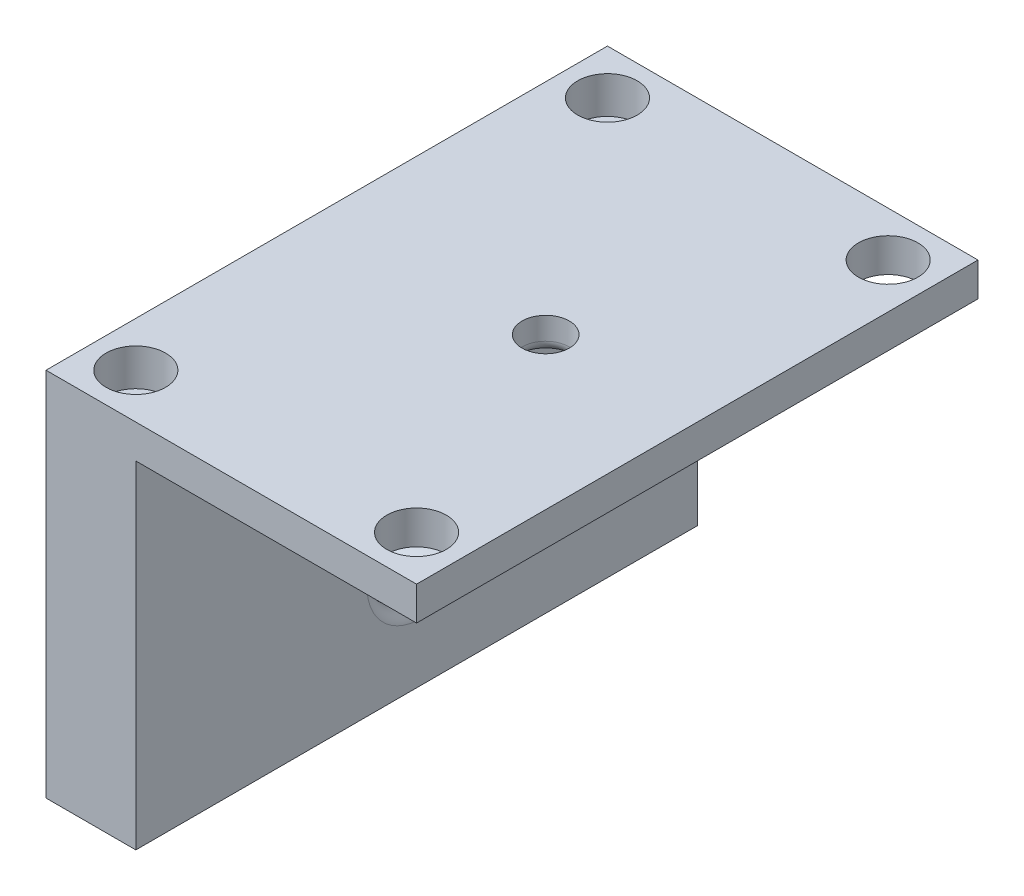
ISO-10303-21;
HEADER;
FILE_DESCRIPTION(('STEP AP214'),'2;1');
FILE_NAME('part.step','',(''),(''),'','','');
FILE_SCHEMA(('AUTOMOTIVE_DESIGN { 1 0 10303 214 1 1 1 1 }'));
ENDSEC;
DATA;
#1=APPLICATION_CONTEXT('core data for automotive mechanical design processes');
#2=APPLICATION_PROTOCOL_DEFINITION('international standard','automotive_design',2000,#1);
#3=PRODUCT_CONTEXT('',#1,'mechanical');
#4=PRODUCT('Part','Part','',(#3));
#5=PRODUCT_RELATED_PRODUCT_CATEGORY('part','',(#4));
#6=PRODUCT_DEFINITION_FORMATION('','',#4);
#7=PRODUCT_DEFINITION_CONTEXT('part definition',#1,'design');
#8=PRODUCT_DEFINITION('design','',#6,#7);
#9=PRODUCT_DEFINITION_SHAPE('','',#8);
#10=(LENGTH_UNIT() NAMED_UNIT(*) SI_UNIT(.MILLI.,.METRE.));
#11=(NAMED_UNIT(*) PLANE_ANGLE_UNIT() SI_UNIT($,.RADIAN.));
#12=(NAMED_UNIT(*) SI_UNIT($,.STERADIAN.) SOLID_ANGLE_UNIT());
#13=UNCERTAINTY_MEASURE_WITH_UNIT(LENGTH_MEASURE(1.E-05),#10,'distance_accuracy_value','');
#14=(GEOMETRIC_REPRESENTATION_CONTEXT(3) GLOBAL_UNCERTAINTY_ASSIGNED_CONTEXT((#13)) GLOBAL_UNIT_ASSIGNED_CONTEXT((#10,
#11,#12)) REPRESENTATION_CONTEXT('',''));
#15=CARTESIAN_POINT('',(0.,0.,0.));
#16=DIRECTION('',(0.,0.,1.));
#17=DIRECTION('',(1.,0.,0.));
#18=AXIS2_PLACEMENT_3D('',#15,#16,#17);
#19=CARTESIAN_POINT('',(0.,0.,0.));
#20=DIRECTION('',(0.,1.,0.));
#21=DIRECTION('',(0.,0.,1.));
#22=AXIS2_PLACEMENT_3D('',#19,#20,#21);
#23=PLANE('',#22);
#24=CARTESIAN_POINT('',(10.7769516728624,0.,-32.3847583643123));
#25=DIRECTION('',(0.,1.,0.));
#26=DIRECTION('',(0.,0.,1.));
#27=AXIS2_PLACEMENT_3D('',#24,#25,#26);
#28=CIRCLE('',#27,2.65);
#29=CARTESIAN_POINT('',(10.7769516728624,0.,-29.7347583643123));
#30=VERTEX_POINT('',#29);
#31=EDGE_CURVE('E264',#30,#30,#28,.F.);
#32=ORIENTED_EDGE('',*,*,#31,.F.);
#33=EDGE_LOOP('',(#32));
#34=FACE_BOUND('',#33,.T.);
#35=CARTESIAN_POINT('',(10.7769516728625,0.,9.61524163568773));
#36=DIRECTION('',(0.,1.,0.));
#37=DIRECTION('',(0.,0.,1.));
#38=AXIS2_PLACEMENT_3D('',#35,#36,#37);
#39=CIRCLE('',#38,2.65);
#40=CARTESIAN_POINT('',(10.7769516728625,0.,12.2652416356877));
#41=VERTEX_POINT('',#40);
#42=EDGE_CURVE('E268',#41,#41,#39,.F.);
#43=ORIENTED_EDGE('',*,*,#42,.F.);
#44=EDGE_LOOP('',(#43));
#45=FACE_BOUND('',#44,.T.);
#46=CARTESIAN_POINT('',(1.27695167286245,0.,-11.3847583643123));
#47=DIRECTION('',(0.,1.,0.));
#48=DIRECTION('',(0.,0.,1.));
#49=AXIS2_PLACEMENT_3D('',#46,#47,#48);
#50=CIRCLE('',#49,3.1);
#51=CARTESIAN_POINT('',(1.27695167286245,0.,-8.28475836431227));
#52=VERTEX_POINT('',#51);
#53=EDGE_CURVE('E105',#52,#52,#50,.T.);
#54=ORIENTED_EDGE('',*,*,#53,.T.);
#55=EDGE_LOOP('',(#54));
#56=FACE_BOUND('',#55,.T.);
#57=DIRECTION('',(0.,0.,1.));
#58=VECTOR('',#57,1.);
#59=CARTESIAN_POINT('',(-10.2230483271376,0.,-36.3847583643123));
#60=LINE('',#59,#58);
#61=CARTESIAN_POINT('',(-10.2230483271376,0.,-36.3847583643123));
#62=VERTEX_POINT('',#61);
#63=CARTESIAN_POINT('',(-10.2230483271376,0.,13.6152416356877));
#64=VERTEX_POINT('',#63);
#65=EDGE_CURVE('E55',#62,#64,#60,.T.);
#66=ORIENTED_EDGE('',*,*,#65,.F.);
#67=DIRECTION('',(-1.,0.,0.));
#68=VECTOR('',#67,1.);
#69=CARTESIAN_POINT('',(-10.2230483271376,0.,-36.3847583643123));
#70=LINE('',#69,#68);
#71=CARTESIAN_POINT('',(14.7769516728625,0.,-36.3847583643123));
#72=VERTEX_POINT('',#71);
#73=EDGE_CURVE('E85',#72,#62,#70,.T.);
#74=ORIENTED_EDGE('',*,*,#73,.F.);
#75=DIRECTION('',(0.,0.,-1.));
#76=VECTOR('',#75,1.);
#77=CARTESIAN_POINT('',(14.7769516728625,0.,-36.3847583643123));
#78=LINE('',#77,#76);
#79=CARTESIAN_POINT('',(14.7769516728625,0.,13.6152416356877));
#80=VERTEX_POINT('',#79);
#81=EDGE_CURVE('E77',#80,#72,#78,.T.);
#82=ORIENTED_EDGE('',*,*,#81,.F.);
#83=DIRECTION('',(1.,0.,0.));
#84=VECTOR('',#83,1.);
#85=CARTESIAN_POINT('',(-10.2230483271375,0.,13.6152416356877));
#86=LINE('',#85,#84);
#87=EDGE_CURVE('E86',#64,#80,#86,.T.);
#88=ORIENTED_EDGE('',*,*,#87,.F.);
#89=EDGE_LOOP('',(#66,#74,#82,#88));
#90=FACE_BOUND('',#89,.T.);
#91=ADVANCED_FACE('F39',(#34,#45,#56,#90),#23,.F.);
#92=CARTESIAN_POINT('',(0.,3.,0.));
#93=DIRECTION('',(0.,1.,0.));
#94=DIRECTION('',(0.,0.,1.));
#95=AXIS2_PLACEMENT_3D('',#92,#93,#94);
#96=PLANE('',#95);
#97=CARTESIAN_POINT('',(10.7769516728624,3.,-32.3847583643123));
#98=DIRECTION('',(0.,-1.,0.));
#99=DIRECTION('',(0.,0.,1.));
#100=AXIS2_PLACEMENT_3D('',#97,#98,#99);
#101=CIRCLE('',#100,2.65);
#102=CARTESIAN_POINT('',(10.7769516728624,3.,-29.7347583643123));
#103=VERTEX_POINT('',#102);
#104=EDGE_CURVE('E272',#103,#103,#101,.T.);
#105=ORIENTED_EDGE('',*,*,#104,.T.);
#106=EDGE_LOOP('',(#105));
#107=FACE_BOUND('',#106,.T.);
#108=CARTESIAN_POINT('',(10.7769516728625,3.,9.61524163568773));
#109=DIRECTION('',(0.,-1.,0.));
#110=DIRECTION('',(0.,0.,1.));
#111=AXIS2_PLACEMENT_3D('',#108,#109,#110);
#112=CIRCLE('',#111,2.65);
#113=CARTESIAN_POINT('',(10.7769516728625,3.,12.2652416356877));
#114=VERTEX_POINT('',#113);
#115=EDGE_CURVE('E273',#114,#114,#112,.T.);
#116=ORIENTED_EDGE('',*,*,#115,.T.);
#117=EDGE_LOOP('',(#116));
#118=FACE_BOUND('',#117,.T.);
#119=CARTESIAN_POINT('',(-14.2230483271375,3.,-32.3847583643123));
#120=DIRECTION('',(0.,1.,0.));
#121=DIRECTION('',(0.,0.,1.));
#122=AXIS2_PLACEMENT_3D('',#119,#120,#121);
#123=CIRCLE('',#122,2.65);
#124=CARTESIAN_POINT('',(-14.2230483271375,3.,-29.7347583643123));
#125=VERTEX_POINT('',#124);
#126=EDGE_CURVE('E238',#125,#125,#123,.T.);
#127=ORIENTED_EDGE('',*,*,#126,.F.);
#128=EDGE_LOOP('',(#127));
#129=FACE_BOUND('',#128,.T.);
#130=CARTESIAN_POINT('',(-14.2230483271375,3.,9.61524163568773));
#131=DIRECTION('',(0.,1.,0.));
#132=DIRECTION('',(0.,0.,1.));
#133=AXIS2_PLACEMENT_3D('',#130,#131,#132);
#134=CIRCLE('',#133,2.65);
#135=CARTESIAN_POINT('',(-14.2230483271375,3.,12.2652416356877));
#136=VERTEX_POINT('',#135);
#137=EDGE_CURVE('E229',#136,#136,#134,.T.);
#138=ORIENTED_EDGE('',*,*,#137,.F.);
#139=EDGE_LOOP('',(#138));
#140=FACE_BOUND('',#139,.T.);
#141=DIRECTION('',(-1.,0.,0.));
#142=VECTOR('',#141,1.);
#143=CARTESIAN_POINT('',(-10.2230483271376,3.,-36.3847583643123));
#144=LINE('',#143,#142);
#145=CARTESIAN_POINT('',(14.7769516728625,3.,-36.3847583643123));
#146=VERTEX_POINT('',#145);
#147=CARTESIAN_POINT('',(-18.2230483271376,3.,-36.3847583643123));
#148=VERTEX_POINT('',#147);
#149=EDGE_CURVE('E93',#146,#148,#144,.T.);
#150=ORIENTED_EDGE('',*,*,#149,.T.);
#151=DIRECTION('',(0.,0.,-1.));
#152=VECTOR('',#151,1.);
#153=CARTESIAN_POINT('',(-18.2230483271376,3.,-36.3847583643123));
#154=LINE('',#153,#152);
#155=CARTESIAN_POINT('',(-18.2230483271375,3.,13.6152416356877));
#156=VERTEX_POINT('',#155);
#157=EDGE_CURVE('E177',#156,#148,#154,.T.);
#158=ORIENTED_EDGE('',*,*,#157,.F.);
#159=DIRECTION('',(1.,0.,0.));
#160=VECTOR('',#159,1.);
#161=CARTESIAN_POINT('',(-10.2230483271375,3.,13.6152416356877));
#162=LINE('',#161,#160);
#163=CARTESIAN_POINT('',(14.7769516728625,3.,13.6152416356877));
#164=VERTEX_POINT('',#163);
#165=EDGE_CURVE('E97',#156,#164,#162,.T.);
#166=ORIENTED_EDGE('',*,*,#165,.T.);
#167=DIRECTION('',(0.,0.,-1.));
#168=VECTOR('',#167,1.);
#169=CARTESIAN_POINT('',(14.7769516728625,3.,-36.3847583643123));
#170=LINE('',#169,#168);
#171=EDGE_CURVE('E64',#164,#146,#170,.T.);
#172=ORIENTED_EDGE('',*,*,#171,.T.);
#173=EDGE_LOOP('',(#150,#158,#166,#172));
#174=FACE_BOUND('',#173,.T.);
#175=CARTESIAN_POINT('',(1.27695167286245,3.,-11.3847583643123));
#176=DIRECTION('',(0.,1.,0.));
#177=DIRECTION('',(0.,0.,1.));
#178=AXIS2_PLACEMENT_3D('',#175,#176,#177);
#179=CIRCLE('',#178,2.1);
#180=CARTESIAN_POINT('',(1.27695167286245,3.,-9.28475836431227));
#181=VERTEX_POINT('',#180);
#182=EDGE_CURVE('E174',#181,#181,#179,.T.);
#183=ORIENTED_EDGE('',*,*,#182,.F.);
#184=EDGE_LOOP('',(#183));
#185=FACE_BOUND('',#184,.T.);
#186=ADVANCED_FACE('F135',(#107,#118,#129,#140,#174,#185),#96,.T.);
#187=CARTESIAN_POINT('',(-10.2230483271375,3.,13.6152416356877));
#188=DIRECTION('',(0.,0.,-1.));
#189=DIRECTION('',(-1.,0.,0.));
#190=AXIS2_PLACEMENT_3D('',#187,#188,#189);
#191=PLANE('',#190);
#192=DIRECTION('',(0.,1.,0.));
#193=VECTOR('',#192,1.);
#194=CARTESIAN_POINT('',(-18.2230483271375,3.,13.6152416356877));
#195=LINE('',#194,#193);
#196=CARTESIAN_POINT('',(-18.2230483271376,-30.,13.6152416356877));
#197=VERTEX_POINT('',#196);
#198=EDGE_CURVE('E182',#197,#156,#195,.T.);
#199=ORIENTED_EDGE('',*,*,#198,.F.);
#200=DIRECTION('',(-1.,0.,0.));
#201=VECTOR('',#200,1.);
#202=CARTESIAN_POINT('',(-18.2230483271376,-30.,13.6152416356877));
#203=LINE('',#202,#201);
#204=CARTESIAN_POINT('',(-10.2230483271376,-30.,13.6152416356877));
#205=VERTEX_POINT('',#204);
#206=EDGE_CURVE('E213',#205,#197,#203,.T.);
#207=ORIENTED_EDGE('',*,*,#206,.F.);
#208=DIRECTION('',(0.,1.,0.));
#209=VECTOR('',#208,1.);
#210=CARTESIAN_POINT('',(-10.2230483271376,-30.,13.6152416356877));
#211=LINE('',#210,#209);
#212=EDGE_CURVE('E207',#205,#64,#211,.T.);
#213=ORIENTED_EDGE('',*,*,#212,.T.);
#214=ORIENTED_EDGE('',*,*,#87,.T.);
#215=DIRECTION('',(0.,-1.,0.));
#216=VECTOR('',#215,1.);
#217=CARTESIAN_POINT('',(14.7769516728625,3.,13.6152416356877));
#218=LINE('',#217,#216);
#219=EDGE_CURVE('E83',#164,#80,#218,.T.);
#220=ORIENTED_EDGE('',*,*,#219,.F.);
#221=ORIENTED_EDGE('',*,*,#165,.F.);
#222=EDGE_LOOP('',(#199,#207,#213,#214,#220,#221));
#223=FACE_BOUND('',#222,.T.);
#224=ADVANCED_FACE('F141',(#223),#191,.F.);
#225=CARTESIAN_POINT('',(14.7769516728625,3.,-36.3847583643123));
#226=DIRECTION('',(-1.,0.,0.));
#227=DIRECTION('',(0.,0.,1.));
#228=AXIS2_PLACEMENT_3D('',#225,#226,#227);
#229=PLANE('',#228);
#230=ORIENTED_EDGE('',*,*,#81,.T.);
#231=DIRECTION('',(0.,-1.,0.));
#232=VECTOR('',#231,1.);
#233=CARTESIAN_POINT('',(14.7769516728625,3.,-36.3847583643123));
#234=LINE('',#233,#232);
#235=EDGE_CURVE('E80',#146,#72,#234,.T.);
#236=ORIENTED_EDGE('',*,*,#235,.F.);
#237=ORIENTED_EDGE('',*,*,#171,.F.);
#238=ORIENTED_EDGE('',*,*,#219,.T.);
#239=EDGE_LOOP('',(#230,#236,#237,#238));
#240=FACE_BOUND('',#239,.T.);
#241=ADVANCED_FACE('F79',(#240),#229,.F.);
#242=CARTESIAN_POINT('',(-10.2230483271376,3.,-36.3847583643123));
#243=DIRECTION('',(0.,0.,1.));
#244=DIRECTION('',(1.,0.,0.));
#245=AXIS2_PLACEMENT_3D('',#242,#243,#244);
#246=PLANE('',#245);
#247=ORIENTED_EDGE('',*,*,#73,.T.);
#248=DIRECTION('',(0.,1.,0.));
#249=VECTOR('',#248,1.);
#250=CARTESIAN_POINT('',(-10.2230483271376,-30.,-36.3847583643123));
#251=LINE('',#250,#249);
#252=CARTESIAN_POINT('',(-10.2230483271376,-30.,-36.3847583643123));
#253=VERTEX_POINT('',#252);
#254=EDGE_CURVE('E203',#253,#62,#251,.T.);
#255=ORIENTED_EDGE('',*,*,#254,.F.);
#256=DIRECTION('',(1.,0.,0.));
#257=VECTOR('',#256,1.);
#258=CARTESIAN_POINT('',(-18.2230483271376,-30.,-36.3847583643123));
#259=LINE('',#258,#257);
#260=CARTESIAN_POINT('',(-18.2230483271376,-30.,-36.3847583643123));
#261=VERTEX_POINT('',#260);
#262=EDGE_CURVE('E200',#261,#253,#259,.T.);
#263=ORIENTED_EDGE('',*,*,#262,.F.);
#264=DIRECTION('',(0.,-1.,0.));
#265=VECTOR('',#264,1.);
#266=CARTESIAN_POINT('',(-18.2230483271376,3.,-36.3847583643123));
#267=LINE('',#266,#265);
#268=EDGE_CURVE('E196',#148,#261,#267,.T.);
#269=ORIENTED_EDGE('',*,*,#268,.F.);
#270=ORIENTED_EDGE('',*,*,#149,.F.);
#271=ORIENTED_EDGE('',*,*,#235,.T.);
#272=EDGE_LOOP('',(#247,#255,#263,#269,#270,#271));
#273=FACE_BOUND('',#272,.T.);
#274=ADVANCED_FACE('F89',(#273),#246,.F.);
#275=CARTESIAN_POINT('',(1.27695167286245,3.,-11.3847583643123));
#276=DIRECTION('',(0.,-1.,0.));
#277=DIRECTION('',(0.,0.,-1.));
#278=AXIS2_PLACEMENT_3D('',#275,#276,#277);
#279=CYLINDRICAL_SURFACE('',#278,2.1);
#280=CARTESIAN_POINT('',(1.27695167286245,1.,-11.3847583643123));
#281=DIRECTION('',(0.,1.,0.));
#282=DIRECTION('',(0.,0.,1.));
#283=AXIS2_PLACEMENT_3D('',#280,#281,#282);
#284=CIRCLE('',#283,2.1);
#285=CARTESIAN_POINT('',(1.27695167286245,1.,-9.28475836431227));
#286=VERTEX_POINT('',#285);
#287=EDGE_CURVE('E109',#286,#286,#284,.F.);
#288=ORIENTED_EDGE('',*,*,#287,.T.);
#289=EDGE_LOOP('',(#288));
#290=FACE_BOUND('',#289,.T.);
#291=ORIENTED_EDGE('',*,*,#182,.T.);
#292=EDGE_LOOP('',(#291));
#293=FACE_BOUND('',#292,.T.);
#294=ADVANCED_FACE('F150',(#290,#293),#279,.F.);
#295=CARTESIAN_POINT('',(-18.2230483271375,0.,0.));
#296=DIRECTION('',(-1.,0.,0.));
#297=DIRECTION('',(0.,0.,1.));
#298=AXIS2_PLACEMENT_3D('',#295,#296,#297);
#299=PLANE('',#298);
#300=CARTESIAN_POINT('',(-18.2230483271375,-20.,-11.836279123996));
#301=DIRECTION('',(-1.,0.,0.));
#302=DIRECTION('',(0.,0.,1.));
#303=AXIS2_PLACEMENT_3D('',#300,#301,#302);
#304=CIRCLE('',#303,3.8682468035705);
#305=CARTESIAN_POINT('',(-18.2230483271375,-20.,-7.96803232042551));
#306=VERTEX_POINT('',#305);
#307=EDGE_CURVE('E250',#306,#306,#304,.T.);
#308=ORIENTED_EDGE('',*,*,#307,.F.);
#309=EDGE_LOOP('',(#308));
#310=FACE_BOUND('',#309,.T.);
#311=ORIENTED_EDGE('',*,*,#268,.T.);
#312=DIRECTION('',(0.,0.,-1.));
#313=VECTOR('',#312,1.);
#314=CARTESIAN_POINT('',(-18.2230483271376,-30.,-36.3847583643123));
#315=LINE('',#314,#313);
#316=EDGE_CURVE('E216',#197,#261,#315,.T.);
#317=ORIENTED_EDGE('',*,*,#316,.F.);
#318=ORIENTED_EDGE('',*,*,#198,.T.);
#319=ORIENTED_EDGE('',*,*,#157,.T.);
#320=EDGE_LOOP('',(#311,#317,#318,#319));
#321=FACE_BOUND('',#320,.T.);
#322=ADVANCED_FACE('F171',(#310,#321),#299,.T.);
#323=CARTESIAN_POINT('',(-10.2230483271376,-30.,-36.3847583643123));
#324=DIRECTION('',(-1.,0.,0.));
#325=DIRECTION('',(0.,0.,1.));
#326=AXIS2_PLACEMENT_3D('',#323,#324,#325);
#327=PLANE('',#326);
#328=CARTESIAN_POINT('',(-10.2230483271376,-20.,-11.836279123996));
#329=DIRECTION('',(-1.,0.,0.));
#330=DIRECTION('',(0.,0.,1.));
#331=AXIS2_PLACEMENT_3D('',#328,#329,#330);
#332=CIRCLE('',#331,4.86824680357049);
#333=CARTESIAN_POINT('',(-10.2230483271376,-20.,-6.96803232042551));
#334=VERTEX_POINT('',#333);
#335=EDGE_CURVE('E48',#334,#334,#332,.T.);
#336=ORIENTED_EDGE('',*,*,#335,.T.);
#337=EDGE_LOOP('',(#336));
#338=FACE_BOUND('',#337,.T.);
#339=ORIENTED_EDGE('',*,*,#65,.T.);
#340=ORIENTED_EDGE('',*,*,#212,.F.);
#341=DIRECTION('',(0.,0.,1.));
#342=VECTOR('',#341,1.);
#343=CARTESIAN_POINT('',(-10.2230483271376,-30.,-36.3847583643123));
#344=LINE('',#343,#342);
#345=EDGE_CURVE('E221',#253,#205,#344,.T.);
#346=ORIENTED_EDGE('',*,*,#345,.F.);
#347=ORIENTED_EDGE('',*,*,#254,.T.);
#348=EDGE_LOOP('',(#339,#340,#346,#347));
#349=FACE_BOUND('',#348,.T.);
#350=ADVANCED_FACE('F116',(#338,#349),#327,.F.);
#351=CARTESIAN_POINT('',(0.,-30.,0.));
#352=DIRECTION('',(0.,1.,0.));
#353=DIRECTION('',(0.,0.,1.));
#354=AXIS2_PLACEMENT_3D('',#351,#352,#353);
#355=PLANE('',#354);
#356=CARTESIAN_POINT('',(-14.2230483271375,-30.,-32.3847583643123));
#357=DIRECTION('',(0.,1.,0.));
#358=DIRECTION('',(0.,0.,1.));
#359=AXIS2_PLACEMENT_3D('',#356,#357,#358);
#360=CIRCLE('',#359,2.65);
#361=CARTESIAN_POINT('',(-14.2230483271375,-30.,-29.7347583643123));
#362=VERTEX_POINT('',#361);
#363=EDGE_CURVE('E254',#362,#362,#360,.T.);
#364=ORIENTED_EDGE('',*,*,#363,.T.);
#365=EDGE_LOOP('',(#364));
#366=FACE_BOUND('',#365,.T.);
#367=CARTESIAN_POINT('',(-14.2230483271375,-30.,9.61524163568773));
#368=DIRECTION('',(0.,1.,0.));
#369=DIRECTION('',(0.,0.,1.));
#370=AXIS2_PLACEMENT_3D('',#367,#368,#369);
#371=CIRCLE('',#370,2.65);
#372=CARTESIAN_POINT('',(-14.2230483271375,-30.,12.2652416356877));
#373=VERTEX_POINT('',#372);
#374=EDGE_CURVE('E245',#373,#373,#371,.T.);
#375=ORIENTED_EDGE('',*,*,#374,.T.);
#376=EDGE_LOOP('',(#375));
#377=FACE_BOUND('',#376,.T.);
#378=ORIENTED_EDGE('',*,*,#316,.T.);
#379=ORIENTED_EDGE('',*,*,#262,.T.);
#380=ORIENTED_EDGE('',*,*,#345,.T.);
#381=ORIENTED_EDGE('',*,*,#206,.T.);
#382=EDGE_LOOP('',(#378,#379,#380,#381));
#383=FACE_BOUND('',#382,.T.);
#384=ADVANCED_FACE('F314',(#366,#377,#383),#355,.F.);
#385=CARTESIAN_POINT('',(-14.2230483271375,-0.3,9.61524163568773));
#386=DIRECTION('',(0.,1.,0.));
#387=DIRECTION('',(0.,0.,1.));
#388=AXIS2_PLACEMENT_3D('',#385,#386,#387);
#389=CYLINDRICAL_SURFACE('',#388,2.65);
#390=CARTESIAN_POINT('',(-14.2230483271375,-0.3,9.61524163568773));
#391=DIRECTION('',(0.,1.,0.));
#392=DIRECTION('',(0.,0.,1.));
#393=AXIS2_PLACEMENT_3D('',#390,#391,#392);
#394=CIRCLE('',#393,2.65);
#395=CARTESIAN_POINT('',(-14.2230483271375,-0.3,12.2652416356877));
#396=VERTEX_POINT('',#395);
#397=EDGE_CURVE('E233',#396,#396,#394,.T.);
#398=ORIENTED_EDGE('',*,*,#397,.F.);
#399=EDGE_LOOP('',(#398));
#400=FACE_BOUND('',#399,.T.);
#401=ORIENTED_EDGE('',*,*,#137,.T.);
#402=EDGE_LOOP('',(#401));
#403=FACE_BOUND('',#402,.T.);
#404=ADVANCED_FACE('F310',(#400,#403),#389,.F.);
#405=CARTESIAN_POINT('',(-14.2230483271375,-0.3,9.61524163568773));
#406=DIRECTION('',(0.,1.,0.));
#407=DIRECTION('',(0.,0.,1.));
#408=AXIS2_PLACEMENT_3D('',#405,#406,#407);
#409=PLANE('',#408);
#410=ORIENTED_EDGE('',*,*,#397,.T.);
#411=EDGE_LOOP('',(#410));
#412=FACE_BOUND('',#411,.T.);
#413=ADVANCED_FACE('F306',(#412),#409,.T.);
#414=CARTESIAN_POINT('',(-14.2230483271375,-0.3,-32.3847583643123));
#415=DIRECTION('',(0.,1.,0.));
#416=DIRECTION('',(0.,0.,1.));
#417=AXIS2_PLACEMENT_3D('',#414,#415,#416);
#418=CYLINDRICAL_SURFACE('',#417,2.65);
#419=CARTESIAN_POINT('',(-14.2230483271375,-0.3,-32.3847583643123));
#420=DIRECTION('',(0.,1.,0.));
#421=DIRECTION('',(0.,0.,1.));
#422=AXIS2_PLACEMENT_3D('',#419,#420,#421);
#423=CIRCLE('',#422,2.65);
#424=CARTESIAN_POINT('',(-14.2230483271375,-0.3,-29.7347583643123));
#425=VERTEX_POINT('',#424);
#426=EDGE_CURVE('E217',#425,#425,#423,.T.);
#427=ORIENTED_EDGE('',*,*,#426,.F.);
#428=EDGE_LOOP('',(#427));
#429=FACE_BOUND('',#428,.T.);
#430=ORIENTED_EDGE('',*,*,#126,.T.);
#431=EDGE_LOOP('',(#430));
#432=FACE_BOUND('',#431,.T.);
#433=ADVANCED_FACE('F302',(#429,#432),#418,.F.);
#434=CARTESIAN_POINT('',(-14.2230483271375,-0.3,-32.3847583643123));
#435=DIRECTION('',(0.,1.,0.));
#436=DIRECTION('',(0.,0.,1.));
#437=AXIS2_PLACEMENT_3D('',#434,#435,#436);
#438=PLANE('',#437);
#439=ORIENTED_EDGE('',*,*,#426,.T.);
#440=EDGE_LOOP('',(#439));
#441=FACE_BOUND('',#440,.T.);
#442=ADVANCED_FACE('F298',(#441),#438,.T.);
#443=CARTESIAN_POINT('',(-14.2230483271375,-26.7,9.61524163568773));
#444=DIRECTION('',(0.,-1.,0.));
#445=DIRECTION('',(0.,0.,-1.));
#446=AXIS2_PLACEMENT_3D('',#443,#444,#445);
#447=CYLINDRICAL_SURFACE('',#446,2.65);
#448=CARTESIAN_POINT('',(-14.2230483271375,-26.7,9.61524163568773));
#449=DIRECTION('',(0.,1.,0.));
#450=DIRECTION('',(0.,0.,1.));
#451=AXIS2_PLACEMENT_3D('',#448,#449,#450);
#452=CIRCLE('',#451,2.65);
#453=CARTESIAN_POINT('',(-14.2230483271375,-26.7,12.2652416356877));
#454=VERTEX_POINT('',#453);
#455=EDGE_CURVE('E249',#454,#454,#452,.T.);
#456=ORIENTED_EDGE('',*,*,#455,.T.);
#457=EDGE_LOOP('',(#456));
#458=FACE_BOUND('',#457,.T.);
#459=ORIENTED_EDGE('',*,*,#374,.F.);
#460=EDGE_LOOP('',(#459));
#461=FACE_BOUND('',#460,.T.);
#462=ADVANCED_FACE('F294',(#458,#461),#447,.F.);
#463=CARTESIAN_POINT('',(-14.2230483271375,-26.7,9.61524163568773));
#464=DIRECTION('',(0.,-1.,0.));
#465=DIRECTION('',(0.,0.,1.));
#466=AXIS2_PLACEMENT_3D('',#463,#464,#465);
#467=PLANE('',#466);
#468=ORIENTED_EDGE('',*,*,#455,.F.);
#469=EDGE_LOOP('',(#468));
#470=FACE_BOUND('',#469,.T.);
#471=ADVANCED_FACE('F290',(#470),#467,.T.);
#472=CARTESIAN_POINT('',(-14.2230483271375,-26.7,-32.3847583643123));
#473=DIRECTION('',(0.,-1.,0.));
#474=DIRECTION('',(0.,0.,-1.));
#475=AXIS2_PLACEMENT_3D('',#472,#473,#474);
#476=CYLINDRICAL_SURFACE('',#475,2.65);
#477=CARTESIAN_POINT('',(-14.2230483271375,-26.7,-32.3847583643123));
#478=DIRECTION('',(0.,1.,0.));
#479=DIRECTION('',(0.,0.,1.));
#480=AXIS2_PLACEMENT_3D('',#477,#478,#479);
#481=CIRCLE('',#480,2.65);
#482=CARTESIAN_POINT('',(-14.2230483271375,-26.7,-29.7347583643123));
#483=VERTEX_POINT('',#482);
#484=EDGE_CURVE('E234',#483,#483,#481,.T.);
#485=ORIENTED_EDGE('',*,*,#484,.T.);
#486=EDGE_LOOP('',(#485));
#487=FACE_BOUND('',#486,.T.);
#488=ORIENTED_EDGE('',*,*,#363,.F.);
#489=EDGE_LOOP('',(#488));
#490=FACE_BOUND('',#489,.T.);
#491=ADVANCED_FACE('F161',(#487,#490),#476,.F.);
#492=CARTESIAN_POINT('',(-14.2230483271375,-26.7,-32.3847583643123));
#493=DIRECTION('',(0.,-1.,0.));
#494=DIRECTION('',(0.,0.,1.));
#495=AXIS2_PLACEMENT_3D('',#492,#493,#494);
#496=PLANE('',#495);
#497=ORIENTED_EDGE('',*,*,#484,.F.);
#498=EDGE_LOOP('',(#497));
#499=FACE_BOUND('',#498,.T.);
#500=ADVANCED_FACE('F156',(#499),#496,.T.);
#501=CARTESIAN_POINT('',(1.27695167286245,1.,-11.3847583643123));
#502=DIRECTION('',(0.,1.,0.));
#503=DIRECTION('',(0.,0.,1.));
#504=AXIS2_PLACEMENT_3D('',#501,#502,#503);
#505=TOROIDAL_SURFACE('',#504,3.1,1.);
#506=ORIENTED_EDGE('',*,*,#287,.F.);
#507=EDGE_LOOP('',(#506));
#508=FACE_BOUND('',#507,.T.);
#509=ORIENTED_EDGE('',*,*,#53,.F.);
#510=EDGE_LOOP('',(#509));
#511=FACE_BOUND('',#510,.T.);
#512=ADVANCED_FACE('F130',(#508,#511),#505,.T.);
#513=CARTESIAN_POINT('',(-9.22304832713755,-20.,-11.836279123996));
#514=DIRECTION('',(-1.,0.,0.));
#515=DIRECTION('',(0.,0.,1.));
#516=AXIS2_PLACEMENT_3D('',#513,#514,#515);
#517=CYLINDRICAL_SURFACE('',#516,3.8682468035705);
#518=CARTESIAN_POINT('',(-11.2230483271376,-20.,-11.836279123996));
#519=DIRECTION('',(-1.,0.,0.));
#520=DIRECTION('',(0.,0.,1.));
#521=AXIS2_PLACEMENT_3D('',#518,#519,#520);
#522=CIRCLE('',#521,3.8682468035705);
#523=CARTESIAN_POINT('',(-11.2230483271376,-20.,-7.96803232042551));
#524=VERTEX_POINT('',#523);
#525=EDGE_CURVE('E11',#524,#524,#522,.F.);
#526=ORIENTED_EDGE('',*,*,#525,.T.);
#527=EDGE_LOOP('',(#526));
#528=FACE_BOUND('',#527,.T.);
#529=ORIENTED_EDGE('',*,*,#307,.T.);
#530=EDGE_LOOP('',(#529));
#531=FACE_BOUND('',#530,.T.);
#532=ADVANCED_FACE('F121',(#528,#531),#517,.F.);
#533=CARTESIAN_POINT('',(-11.2230483271376,-20.,-11.836279123996));
#534=DIRECTION('',(-1.,0.,0.));
#535=DIRECTION('',(0.,0.,1.));
#536=AXIS2_PLACEMENT_3D('',#533,#534,#535);
#537=TOROIDAL_SURFACE('',#536,4.86824680357049,1.);
#538=ORIENTED_EDGE('',*,*,#525,.F.);
#539=EDGE_LOOP('',(#538));
#540=FACE_BOUND('',#539,.T.);
#541=ORIENTED_EDGE('',*,*,#335,.F.);
#542=EDGE_LOOP('',(#541));
#543=FACE_BOUND('',#542,.T.);
#544=ADVANCED_FACE('F41',(#540,#543),#537,.T.);
#545=CARTESIAN_POINT('',(10.7769516728625,-0.3,9.61524163568773));
#546=DIRECTION('',(0.,1.,0.));
#547=DIRECTION('',(0.,0.,1.));
#548=AXIS2_PLACEMENT_3D('',#545,#546,#547);
#549=CYLINDRICAL_SURFACE('',#548,2.65);
#550=ORIENTED_EDGE('',*,*,#115,.F.);
#551=EDGE_LOOP('',(#550));
#552=FACE_BOUND('',#551,.T.);
#553=ORIENTED_EDGE('',*,*,#42,.T.);
#554=EDGE_LOOP('',(#553));
#555=FACE_BOUND('',#554,.T.);
#556=ADVANCED_FACE('F120',(#552,#555),#549,.F.);
#557=CARTESIAN_POINT('',(10.7769516728624,-0.3,-32.3847583643123));
#558=DIRECTION('',(0.,1.,0.));
#559=DIRECTION('',(0.,0.,1.));
#560=AXIS2_PLACEMENT_3D('',#557,#558,#559);
#561=CYLINDRICAL_SURFACE('',#560,2.65);
#562=ORIENTED_EDGE('',*,*,#104,.F.);
#563=EDGE_LOOP('',(#562));
#564=FACE_BOUND('',#563,.T.);
#565=ORIENTED_EDGE('',*,*,#31,.T.);
#566=EDGE_LOOP('',(#565));
#567=FACE_BOUND('',#566,.T.);
#568=ADVANCED_FACE('F127',(#564,#567),#561,.F.);
#569=CLOSED_SHELL('',(#91,#186,#224,#241,#274,#294,#322,#350,#384,#404,#413,#433,#442,#462,#471,
#491,#500,#512,#532,#544,#556,#568));
#570=MANIFOLD_SOLID_BREP('B2',#569);
#571=ADVANCED_BREP_SHAPE_REPRESENTATION('',(#18,#570),#14);
#572=SHAPE_DEFINITION_REPRESENTATION(#9,#571);
ENDSEC;
END-ISO-10303-21;
